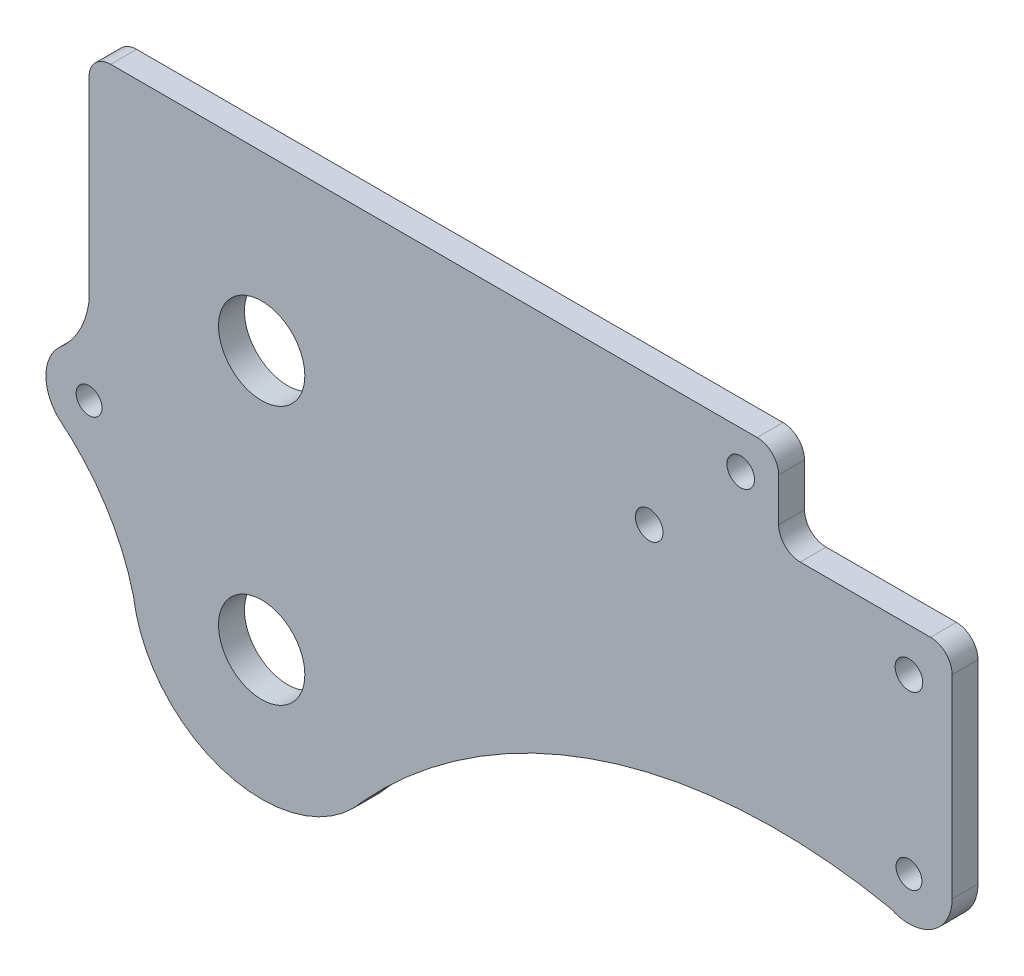
ISO-10303-21;
HEADER;
FILE_DESCRIPTION(('STEP AP214'),'2;1');
FILE_NAME('part.step','',(''),(''),'','','');
FILE_SCHEMA(('AUTOMOTIVE_DESIGN { 1 0 10303 214 1 1 1 1 }'));
ENDSEC;
DATA;
#1=APPLICATION_CONTEXT('core data for automotive mechanical design processes');
#2=APPLICATION_PROTOCOL_DEFINITION('international standard','automotive_design',2000,#1);
#3=PRODUCT_CONTEXT('',#1,'mechanical');
#4=PRODUCT('Part','Part','',(#3));
#5=PRODUCT_RELATED_PRODUCT_CATEGORY('part','',(#4));
#6=PRODUCT_DEFINITION_FORMATION('','',#4);
#7=PRODUCT_DEFINITION_CONTEXT('part definition',#1,'design');
#8=PRODUCT_DEFINITION('design','',#6,#7);
#9=PRODUCT_DEFINITION_SHAPE('','',#8);
#10=(LENGTH_UNIT() NAMED_UNIT(*) SI_UNIT(.MILLI.,.METRE.));
#11=(NAMED_UNIT(*) PLANE_ANGLE_UNIT() SI_UNIT($,.RADIAN.));
#12=(NAMED_UNIT(*) SI_UNIT($,.STERADIAN.) SOLID_ANGLE_UNIT());
#13=UNCERTAINTY_MEASURE_WITH_UNIT(LENGTH_MEASURE(1.E-05),#10,'distance_accuracy_value','');
#14=(GEOMETRIC_REPRESENTATION_CONTEXT(3) GLOBAL_UNCERTAINTY_ASSIGNED_CONTEXT((#13)) GLOBAL_UNIT_ASSIGNED_CONTEXT((#10,
#11,#12)) REPRESENTATION_CONTEXT('',''));
#15=CARTESIAN_POINT('',(0.,0.,0.));
#16=DIRECTION('',(0.,0.,1.));
#17=DIRECTION('',(1.,0.,0.));
#18=AXIS2_PLACEMENT_3D('',#15,#16,#17);
#19=CARTESIAN_POINT('',(0.,60.,3.));
#20=DIRECTION('',(0.,1.,0.));
#21=DIRECTION('',(0.,0.,1.));
#22=AXIS2_PLACEMENT_3D('',#19,#20,#21);
#23=PLANE('',#22);
#24=DIRECTION('',(1.,0.,0.));
#25=VECTOR('',#24,1.);
#26=CARTESIAN_POINT('',(0.,60.,3.));
#27=LINE('',#26,#25);
#28=CARTESIAN_POINT('',(82.3999999999994,60.,3.));
#29=VERTEX_POINT('',#28);
#30=CARTESIAN_POINT('',(97.5,60.,3.));
#31=VERTEX_POINT('',#30);
#32=EDGE_CURVE('E336',#29,#31,#27,.T.);
#33=ORIENTED_EDGE('',*,*,#32,.T.);
#34=DIRECTION('',(0.,0.,-1.));
#35=VECTOR('',#34,1.);
#36=CARTESIAN_POINT('',(97.5,60.,3.));
#37=LINE('',#36,#35);
#38=CARTESIAN_POINT('',(97.5,60.,0.));
#39=VERTEX_POINT('',#38);
#40=EDGE_CURVE('E365',#31,#39,#37,.T.);
#41=ORIENTED_EDGE('',*,*,#40,.T.);
#42=DIRECTION('',(1.,0.,0.));
#43=VECTOR('',#42,1.);
#44=CARTESIAN_POINT('',(0.,60.,0.));
#45=LINE('',#44,#43);
#46=CARTESIAN_POINT('',(82.3999999999994,60.,0.));
#47=VERTEX_POINT('',#46);
#48=EDGE_CURVE('E346',#47,#39,#45,.T.);
#49=ORIENTED_EDGE('',*,*,#48,.F.);
#50=DIRECTION('',(0.,0.,1.));
#51=VECTOR('',#50,1.);
#52=CARTESIAN_POINT('',(82.3999999999994,60.,3.));
#53=LINE('',#52,#51);
#54=EDGE_CURVE('E368',#47,#29,#53,.T.);
#55=ORIENTED_EDGE('',*,*,#54,.T.);
#56=EDGE_LOOP('',(#33,#41,#49,#55));
#57=FACE_BOUND('',#56,.T.);
#58=ADVANCED_FACE('F39',(#57),#23,.T.);
#59=CARTESIAN_POINT('',(0.,0.,3.));
#60=DIRECTION('',(0.,0.,1.));
#61=DIRECTION('',(1.,0.,0.));
#62=AXIS2_PLACEMENT_3D('',#59,#60,#61);
#63=PLANE('',#62);
#64=CARTESIAN_POINT('',(95.,55.,3.));
#65=DIRECTION('',(0.,0.,1.));
#66=DIRECTION('',(1.,0.,0.));
#67=AXIS2_PLACEMENT_3D('',#64,#65,#66);
#68=CIRCLE('',#67,1.60000000000001);
#69=CARTESIAN_POINT('',(96.6,55.,3.));
#70=VERTEX_POINT('',#69);
#71=EDGE_CURVE('E267',#70,#70,#68,.T.);
#72=ORIENTED_EDGE('',*,*,#71,.F.);
#73=EDGE_LOOP('',(#72));
#74=FACE_BOUND('',#73,.T.);
#75=CARTESIAN_POINT('',(64.8999999999994,55.,3.));
#76=DIRECTION('',(0.,0.,1.));
#77=DIRECTION('',(1.,0.,0.));
#78=AXIS2_PLACEMENT_3D('',#75,#76,#77);
#79=CIRCLE('',#78,1.60000000000001);
#80=CARTESIAN_POINT('',(66.4999999999994,55.,3.));
#81=VERTEX_POINT('',#80);
#82=EDGE_CURVE('E181',#81,#81,#79,.T.);
#83=ORIENTED_EDGE('',*,*,#82,.F.);
#84=EDGE_LOOP('',(#83));
#85=FACE_BOUND('',#84,.T.);
#86=CARTESIAN_POINT('',(20.,50.,3.));
#87=DIRECTION('',(0.,0.,1.));
#88=DIRECTION('',(1.,0.,0.));
#89=AXIS2_PLACEMENT_3D('',#86,#87,#88);
#90=CIRCLE('',#89,5.);
#91=CARTESIAN_POINT('',(25.,50.,3.));
#92=VERTEX_POINT('',#91);
#93=EDGE_CURVE('E239',#92,#92,#90,.T.);
#94=ORIENTED_EDGE('',*,*,#93,.F.);
#95=EDGE_LOOP('',(#94));
#96=FACE_BOUND('',#95,.T.);
#97=DIRECTION('',(-1.,0.,0.));
#98=VECTOR('',#97,1.);
#99=CARTESIAN_POINT('',(0.,70.,3.));
#100=LINE('',#99,#98);
#101=CARTESIAN_POINT('',(77.3999999999994,70.,3.));
#102=VERTEX_POINT('',#101);
#103=CARTESIAN_POINT('',(2.5,70.,3.));
#104=VERTEX_POINT('',#103);
#105=EDGE_CURVE('E254',#102,#104,#100,.T.);
#106=ORIENTED_EDGE('',*,*,#105,.T.);
#107=CARTESIAN_POINT('',(2.5,67.5,3.));
#108=DIRECTION('',(0.,0.,1.));
#109=DIRECTION('',(1.,0.,0.));
#110=AXIS2_PLACEMENT_3D('',#107,#108,#109);
#111=CIRCLE('',#110,2.5);
#112=CARTESIAN_POINT('',(0.,67.5,3.));
#113=VERTEX_POINT('',#112);
#114=EDGE_CURVE('E321',#104,#113,#111,.T.);
#115=ORIENTED_EDGE('',*,*,#114,.T.);
#116=DIRECTION('',(0.,-1.,0.));
#117=VECTOR('',#116,1.);
#118=CARTESIAN_POINT('',(0.,0.,3.));
#119=LINE('',#118,#117);
#120=CARTESIAN_POINT('',(0.,45.,3.));
#121=VERTEX_POINT('',#120);
#122=EDGE_CURVE('E339',#113,#121,#119,.T.);
#123=ORIENTED_EDGE('',*,*,#122,.T.);
#124=CARTESIAN_POINT('',(-9.92422965861552,46.2286845335789,3.));
#125=DIRECTION('',(0.,0.,1.));
#126=DIRECTION('',(1.,0.,0.));
#127=AXIS2_PLACEMENT_3D('',#124,#125,#126);
#128=CIRCLE('',#127,10.);
#129=CARTESIAN_POINT('',(-3.53553390593274,38.5355339059327,3.));
#130=VERTEX_POINT('',#129);
#131=EDGE_CURVE('E178',#130,#121,#128,.T.);
#132=ORIENTED_EDGE('',*,*,#131,.F.);
#133=CARTESIAN_POINT('',(0.,35.,3.));
#134=DIRECTION('',(0.,0.,1.));
#135=DIRECTION('',(1.,0.,0.));
#136=AXIS2_PLACEMENT_3D('',#133,#134,#135);
#137=CIRCLE('',#136,5.);
#138=CARTESIAN_POINT('',(-3.53553390593273,31.4644660940673,3.));
#139=VERTEX_POINT('',#138);
#140=EDGE_CURVE('E151',#130,#139,#137,.T.);
#141=ORIENTED_EDGE('',*,*,#140,.T.);
#142=CARTESIAN_POINT('',(-19.1132319588568,11.9110693719648,3.));
#143=DIRECTION('',(0.,0.,1.));
#144=DIRECTION('',(1.,0.,0.));
#145=AXIS2_PLACEMENT_3D('',#142,#143,#144);
#146=CIRCLE('',#145,25.);
#147=CARTESIAN_POINT('',(5.13393125268149,18.0000000000001,3.));
#148=VERTEX_POINT('',#147);
#149=EDGE_CURVE('E235',#139,#148,#146,.F.);
#150=ORIENTED_EDGE('',*,*,#149,.T.);
#151=CARTESIAN_POINT('',(20.,20.,3.));
#152=DIRECTION('',(0.,0.,1.));
#153=DIRECTION('',(1.,0.,0.));
#154=AXIS2_PLACEMENT_3D('',#151,#152,#153);
#155=CIRCLE('',#154,15.);
#156=CARTESIAN_POINT('',(31.7611178798317,10.6899996661276,3.));
#157=VERTEX_POINT('',#156);
#158=EDGE_CURVE('E194',#148,#157,#155,.T.);
#159=ORIENTED_EDGE('',*,*,#158,.T.);
#160=CARTESIAN_POINT('',(79.7242790227011,-33.1795247578178,3.));
#161=DIRECTION('',(0.,0.,1.));
#162=DIRECTION('',(1.,0.,0.));
#163=AXIS2_PLACEMENT_3D('',#160,#161,#162);
#164=CIRCLE('',#163,65.);
#165=CARTESIAN_POINT('',(92.8665811576552,30.4779955724117,3.));
#166=VERTEX_POINT('',#165);
#167=EDGE_CURVE('E198',#157,#166,#164,.F.);
#168=ORIENTED_EDGE('',*,*,#167,.T.);
#169=CARTESIAN_POINT('',(95.,35.,3.));
#170=DIRECTION('',(0.,0.,1.));
#171=DIRECTION('',(1.,0.,0.));
#172=AXIS2_PLACEMENT_3D('',#169,#170,#171);
#173=CIRCLE('',#172,5.00000000000001);
#174=CARTESIAN_POINT('',(100.,35.,3.));
#175=VERTEX_POINT('',#174);
#176=EDGE_CURVE('E197',#166,#175,#173,.T.);
#177=ORIENTED_EDGE('',*,*,#176,.T.);
#178=DIRECTION('',(0.,-1.,0.));
#179=VECTOR('',#178,1.);
#180=CARTESIAN_POINT('',(100.,0.,3.));
#181=LINE('',#180,#179);
#182=CARTESIAN_POINT('',(100.,57.5,3.));
#183=VERTEX_POINT('',#182);
#184=EDGE_CURVE('E325',#183,#175,#181,.T.);
#185=ORIENTED_EDGE('',*,*,#184,.F.);
#186=CARTESIAN_POINT('',(97.5,57.5,3.));
#187=DIRECTION('',(0.,0.,1.));
#188=DIRECTION('',(1.,0.,0.));
#189=AXIS2_PLACEMENT_3D('',#186,#187,#188);
#190=CIRCLE('',#189,2.5);
#191=EDGE_CURVE('E324',#183,#31,#190,.T.);
#192=ORIENTED_EDGE('',*,*,#191,.T.);
#193=ORIENTED_EDGE('',*,*,#32,.F.);
#194=CARTESIAN_POINT('',(82.3999999999994,62.5,3.));
#195=DIRECTION('',(0.,0.,1.));
#196=DIRECTION('',(1.,0.,0.));
#197=AXIS2_PLACEMENT_3D('',#194,#195,#196);
#198=CIRCLE('',#197,2.5);
#199=CARTESIAN_POINT('',(79.8999999999994,62.5,3.));
#200=VERTEX_POINT('',#199);
#201=EDGE_CURVE('E47',#29,#200,#198,.F.);
#202=ORIENTED_EDGE('',*,*,#201,.T.);
#203=DIRECTION('',(0.,1.,0.));
#204=VECTOR('',#203,1.);
#205=CARTESIAN_POINT('',(79.8999999999994,60.,3.));
#206=LINE('',#205,#204);
#207=CARTESIAN_POINT('',(79.8999999999994,67.5,3.));
#208=VERTEX_POINT('',#207);
#209=EDGE_CURVE('E260',#200,#208,#206,.T.);
#210=ORIENTED_EDGE('',*,*,#209,.T.);
#211=CARTESIAN_POINT('',(77.3999999999994,67.5,3.));
#212=DIRECTION('',(0.,0.,1.));
#213=DIRECTION('',(1.,0.,0.));
#214=AXIS2_PLACEMENT_3D('',#211,#212,#213);
#215=CIRCLE('',#214,2.5);
#216=EDGE_CURVE('E322',#208,#102,#215,.T.);
#217=ORIENTED_EDGE('',*,*,#216,.T.);
#218=EDGE_LOOP('',(#106,#115,#123,#132,#141,#150,#159,#168,#177,#185,#192,#193,#202,#210,#217));
#219=FACE_BOUND('',#218,.T.);
#220=CARTESIAN_POINT('',(95.,35.,3.));
#221=DIRECTION('',(0.,0.,1.));
#222=DIRECTION('',(1.,0.,0.));
#223=AXIS2_PLACEMENT_3D('',#220,#221,#222);
#224=CIRCLE('',#223,1.5);
#225=CARTESIAN_POINT('',(96.5,35.,3.));
#226=VERTEX_POINT('',#225);
#227=EDGE_CURVE('E207',#226,#226,#224,.T.);
#228=ORIENTED_EDGE('',*,*,#227,.F.);
#229=EDGE_LOOP('',(#228));
#230=FACE_BOUND('',#229,.T.);
#231=CARTESIAN_POINT('',(20.,20.,3.));
#232=DIRECTION('',(0.,0.,1.));
#233=DIRECTION('',(1.,0.,0.));
#234=AXIS2_PLACEMENT_3D('',#231,#232,#233);
#235=CIRCLE('',#234,5.);
#236=CARTESIAN_POINT('',(25.,20.,3.));
#237=VERTEX_POINT('',#236);
#238=EDGE_CURVE('E223',#237,#237,#235,.T.);
#239=ORIENTED_EDGE('',*,*,#238,.F.);
#240=EDGE_LOOP('',(#239));
#241=FACE_BOUND('',#240,.T.);
#242=CARTESIAN_POINT('',(0.,35.,3.));
#243=DIRECTION('',(0.,0.,1.));
#244=DIRECTION('',(1.,0.,0.));
#245=AXIS2_PLACEMENT_3D('',#242,#243,#244);
#246=CIRCLE('',#245,1.5);
#247=CARTESIAN_POINT('',(1.50000000000001,35.,3.));
#248=VERTEX_POINT('',#247);
#249=EDGE_CURVE('E165',#248,#248,#246,.T.);
#250=ORIENTED_EDGE('',*,*,#249,.F.);
#251=EDGE_LOOP('',(#250));
#252=FACE_BOUND('',#251,.T.);
#253=CARTESIAN_POINT('',(75.5066017177976,65.6066017177982,3.));
#254=DIRECTION('',(0.,0.,1.));
#255=DIRECTION('',(1.,0.,0.));
#256=AXIS2_PLACEMENT_3D('',#253,#254,#255);
#257=CIRCLE('',#256,1.60000000000001);
#258=CARTESIAN_POINT('',(77.1066017177976,65.6066017177982,3.));
#259=VERTEX_POINT('',#258);
#260=EDGE_CURVE('E298',#259,#259,#257,.T.);
#261=ORIENTED_EDGE('',*,*,#260,.F.);
#262=EDGE_LOOP('',(#261));
#263=FACE_BOUND('',#262,.T.);
#264=ADVANCED_FACE('F280',(#74,#85,#96,#219,#230,#241,#252,#263),#63,.T.);
#265=CARTESIAN_POINT('',(0.,0.,0.));
#266=DIRECTION('',(0.,0.,1.));
#267=DIRECTION('',(1.,0.,0.));
#268=AXIS2_PLACEMENT_3D('',#265,#266,#267);
#269=PLANE('',#268);
#270=CARTESIAN_POINT('',(95.,55.,0.));
#271=DIRECTION('',(0.,0.,1.));
#272=DIRECTION('',(1.,0.,0.));
#273=AXIS2_PLACEMENT_3D('',#270,#271,#272);
#274=CIRCLE('',#273,1.60000000000001);
#275=CARTESIAN_POINT('',(96.6,55.,0.));
#276=VERTEX_POINT('',#275);
#277=EDGE_CURVE('E263',#276,#276,#274,.T.);
#278=ORIENTED_EDGE('',*,*,#277,.T.);
#279=EDGE_LOOP('',(#278));
#280=FACE_BOUND('',#279,.T.);
#281=CARTESIAN_POINT('',(64.8999999999994,55.,0.));
#282=DIRECTION('',(0.,0.,1.));
#283=DIRECTION('',(1.,0.,0.));
#284=AXIS2_PLACEMENT_3D('',#281,#282,#283);
#285=CIRCLE('',#284,1.60000000000001);
#286=CARTESIAN_POINT('',(66.4999999999994,55.,0.));
#287=VERTEX_POINT('',#286);
#288=EDGE_CURVE('E266',#287,#287,#285,.T.);
#289=ORIENTED_EDGE('',*,*,#288,.T.);
#290=EDGE_LOOP('',(#289));
#291=FACE_BOUND('',#290,.T.);
#292=CARTESIAN_POINT('',(20.,50.,0.));
#293=DIRECTION('',(0.,0.,1.));
#294=DIRECTION('',(1.,0.,0.));
#295=AXIS2_PLACEMENT_3D('',#292,#293,#294);
#296=CIRCLE('',#295,5.);
#297=CARTESIAN_POINT('',(25.,50.,0.));
#298=VERTEX_POINT('',#297);
#299=EDGE_CURVE('E241',#298,#298,#296,.T.);
#300=ORIENTED_EDGE('',*,*,#299,.T.);
#301=EDGE_LOOP('',(#300));
#302=FACE_BOUND('',#301,.T.);
#303=DIRECTION('',(0.,-1.,0.));
#304=VECTOR('',#303,1.);
#305=CARTESIAN_POINT('',(0.,0.,0.));
#306=LINE('',#305,#304);
#307=CARTESIAN_POINT('',(0.,67.5,0.));
#308=VERTEX_POINT('',#307);
#309=CARTESIAN_POINT('',(0.,45.,0.));
#310=VERTEX_POINT('',#309);
#311=EDGE_CURVE('E345',#308,#310,#306,.T.);
#312=ORIENTED_EDGE('',*,*,#311,.F.);
#313=CARTESIAN_POINT('',(2.5,67.5,0.));
#314=DIRECTION('',(0.,0.,1.));
#315=DIRECTION('',(1.,0.,0.));
#316=AXIS2_PLACEMENT_3D('',#313,#314,#315);
#317=CIRCLE('',#316,2.5);
#318=CARTESIAN_POINT('',(2.5,70.,0.));
#319=VERTEX_POINT('',#318);
#320=EDGE_CURVE('E320',#308,#319,#317,.F.);
#321=ORIENTED_EDGE('',*,*,#320,.T.);
#322=DIRECTION('',(-1.,0.,0.));
#323=VECTOR('',#322,1.);
#324=CARTESIAN_POINT('',(0.,70.,0.));
#325=LINE('',#324,#323);
#326=CARTESIAN_POINT('',(77.3999999999994,70.,0.));
#327=VERTEX_POINT('',#326);
#328=EDGE_CURVE('E271',#327,#319,#325,.T.);
#329=ORIENTED_EDGE('',*,*,#328,.F.);
#330=CARTESIAN_POINT('',(77.3999999999994,67.5,0.));
#331=DIRECTION('',(0.,0.,1.));
#332=DIRECTION('',(1.,0.,0.));
#333=AXIS2_PLACEMENT_3D('',#330,#331,#332);
#334=CIRCLE('',#333,2.5);
#335=CARTESIAN_POINT('',(79.8999999999994,67.5,0.));
#336=VERTEX_POINT('',#335);
#337=EDGE_CURVE('E418',#327,#336,#334,.F.);
#338=ORIENTED_EDGE('',*,*,#337,.T.);
#339=DIRECTION('',(0.,1.,0.));
#340=VECTOR('',#339,1.);
#341=CARTESIAN_POINT('',(79.8999999999994,60.,0.));
#342=LINE('',#341,#340);
#343=CARTESIAN_POINT('',(79.8999999999994,62.5,0.));
#344=VERTEX_POINT('',#343);
#345=EDGE_CURVE('E259',#344,#336,#342,.T.);
#346=ORIENTED_EDGE('',*,*,#345,.F.);
#347=CARTESIAN_POINT('',(82.3999999999994,62.5,0.));
#348=DIRECTION('',(0.,0.,1.));
#349=DIRECTION('',(1.,0.,0.));
#350=AXIS2_PLACEMENT_3D('',#347,#348,#349);
#351=CIRCLE('',#350,2.5);
#352=EDGE_CURVE('E12',#344,#47,#351,.T.);
#353=ORIENTED_EDGE('',*,*,#352,.T.);
#354=ORIENTED_EDGE('',*,*,#48,.T.);
#355=CARTESIAN_POINT('',(97.5,57.5,0.));
#356=DIRECTION('',(0.,0.,1.));
#357=DIRECTION('',(1.,0.,0.));
#358=AXIS2_PLACEMENT_3D('',#355,#356,#357);
#359=CIRCLE('',#358,2.5);
#360=CARTESIAN_POINT('',(100.,57.5,0.));
#361=VERTEX_POINT('',#360);
#362=EDGE_CURVE('E54',#39,#361,#359,.F.);
#363=ORIENTED_EDGE('',*,*,#362,.T.);
#364=DIRECTION('',(0.,-1.,0.));
#365=VECTOR('',#364,1.);
#366=CARTESIAN_POINT('',(100.,0.,0.));
#367=LINE('',#366,#365);
#368=CARTESIAN_POINT('',(100.,35.,0.));
#369=VERTEX_POINT('',#368);
#370=EDGE_CURVE('E348',#361,#369,#367,.T.);
#371=ORIENTED_EDGE('',*,*,#370,.T.);
#372=CARTESIAN_POINT('',(95.,35.,0.));
#373=DIRECTION('',(0.,0.,1.));
#374=DIRECTION('',(1.,0.,0.));
#375=AXIS2_PLACEMENT_3D('',#372,#373,#374);
#376=CIRCLE('',#375,5.00000000000001);
#377=CARTESIAN_POINT('',(92.8665811576552,30.4779955724117,0.));
#378=VERTEX_POINT('',#377);
#379=EDGE_CURVE('E215',#378,#369,#376,.T.);
#380=ORIENTED_EDGE('',*,*,#379,.F.);
#381=CARTESIAN_POINT('',(79.7242790227011,-33.1795247578178,0.));
#382=DIRECTION('',(0.,0.,1.));
#383=DIRECTION('',(1.,0.,0.));
#384=AXIS2_PLACEMENT_3D('',#381,#382,#383);
#385=CIRCLE('',#384,65.);
#386=CARTESIAN_POINT('',(31.7611178798317,10.6899996661276,0.));
#387=VERTEX_POINT('',#386);
#388=EDGE_CURVE('E203',#387,#378,#385,.F.);
#389=ORIENTED_EDGE('',*,*,#388,.F.);
#390=CARTESIAN_POINT('',(20.,20.,0.));
#391=DIRECTION('',(0.,0.,1.));
#392=DIRECTION('',(1.,0.,0.));
#393=AXIS2_PLACEMENT_3D('',#390,#391,#392);
#394=CIRCLE('',#393,15.);
#395=CARTESIAN_POINT('',(5.1339312526815,18.,0.));
#396=VERTEX_POINT('',#395);
#397=EDGE_CURVE('E357',#396,#387,#394,.T.);
#398=ORIENTED_EDGE('',*,*,#397,.F.);
#399=CARTESIAN_POINT('',(-19.1132319588568,11.9110693719648,0.));
#400=DIRECTION('',(0.,0.,1.));
#401=DIRECTION('',(1.,0.,0.));
#402=AXIS2_PLACEMENT_3D('',#399,#400,#401);
#403=CIRCLE('',#402,25.);
#404=CARTESIAN_POINT('',(-3.53553390593273,31.4644660940673,0.));
#405=VERTEX_POINT('',#404);
#406=EDGE_CURVE('E171',#405,#396,#403,.F.);
#407=ORIENTED_EDGE('',*,*,#406,.F.);
#408=CARTESIAN_POINT('',(0.,35.,0.));
#409=DIRECTION('',(0.,0.,1.));
#410=DIRECTION('',(1.,0.,0.));
#411=AXIS2_PLACEMENT_3D('',#408,#409,#410);
#412=CIRCLE('',#411,5.);
#413=CARTESIAN_POINT('',(-3.53553390593274,38.5355339059327,0.));
#414=VERTEX_POINT('',#413);
#415=EDGE_CURVE('E149',#414,#405,#412,.T.);
#416=ORIENTED_EDGE('',*,*,#415,.F.);
#417=CARTESIAN_POINT('',(-9.92422965861552,46.2286845335789,0.));
#418=DIRECTION('',(0.,0.,1.));
#419=DIRECTION('',(1.,0.,0.));
#420=AXIS2_PLACEMENT_3D('',#417,#418,#419);
#421=CIRCLE('',#420,10.);
#422=EDGE_CURVE('E160',#414,#310,#421,.T.);
#423=ORIENTED_EDGE('',*,*,#422,.T.);
#424=EDGE_LOOP('',(#312,#321,#329,#338,#346,#353,#354,#363,#371,#380,#389,#398,#407,#416,#423));
#425=FACE_BOUND('',#424,.T.);
#426=CARTESIAN_POINT('',(20.,20.,0.));
#427=DIRECTION('',(0.,0.,1.));
#428=DIRECTION('',(1.,0.,0.));
#429=AXIS2_PLACEMENT_3D('',#426,#427,#428);
#430=CIRCLE('',#429,5.);
#431=CARTESIAN_POINT('',(25.,20.,0.));
#432=VERTEX_POINT('',#431);
#433=EDGE_CURVE('E219',#432,#432,#430,.T.);
#434=ORIENTED_EDGE('',*,*,#433,.T.);
#435=EDGE_LOOP('',(#434));
#436=FACE_BOUND('',#435,.T.);
#437=CARTESIAN_POINT('',(95.,35.,0.));
#438=DIRECTION('',(0.,0.,1.));
#439=DIRECTION('',(1.,0.,0.));
#440=AXIS2_PLACEMENT_3D('',#437,#438,#439);
#441=CIRCLE('',#440,1.5);
#442=CARTESIAN_POINT('',(96.5,35.,0.));
#443=VERTEX_POINT('',#442);
#444=EDGE_CURVE('E216',#443,#443,#441,.T.);
#445=ORIENTED_EDGE('',*,*,#444,.T.);
#446=EDGE_LOOP('',(#445));
#447=FACE_BOUND('',#446,.T.);
#448=CARTESIAN_POINT('',(0.,35.,0.));
#449=DIRECTION('',(0.,0.,1.));
#450=DIRECTION('',(1.,0.,0.));
#451=AXIS2_PLACEMENT_3D('',#448,#449,#450);
#452=CIRCLE('',#451,1.5);
#453=CARTESIAN_POINT('',(1.50000000000001,35.,0.));
#454=VERTEX_POINT('',#453);
#455=EDGE_CURVE('E156',#454,#454,#452,.T.);
#456=ORIENTED_EDGE('',*,*,#455,.T.);
#457=EDGE_LOOP('',(#456));
#458=FACE_BOUND('',#457,.T.);
#459=CARTESIAN_POINT('',(75.5066017177976,65.6066017177982,0.));
#460=DIRECTION('',(0.,0.,1.));
#461=DIRECTION('',(1.,0.,0.));
#462=AXIS2_PLACEMENT_3D('',#459,#460,#461);
#463=CIRCLE('',#462,1.60000000000001);
#464=CARTESIAN_POINT('',(77.1066017177976,65.6066017177982,0.));
#465=VERTEX_POINT('',#464);
#466=EDGE_CURVE('E300',#465,#465,#463,.T.);
#467=ORIENTED_EDGE('',*,*,#466,.T.);
#468=EDGE_LOOP('',(#467));
#469=FACE_BOUND('',#468,.T.);
#470=ADVANCED_FACE('F168',(#280,#291,#302,#425,#436,#447,#458,#469),#269,.F.);
#471=CARTESIAN_POINT('',(0.,0.,3.));
#472=DIRECTION('',(1.,0.,0.));
#473=DIRECTION('',(0.,1.,0.));
#474=AXIS2_PLACEMENT_3D('',#471,#472,#473);
#475=PLANE('',#474);
#476=ORIENTED_EDGE('',*,*,#122,.F.);
#477=DIRECTION('',(0.,0.,1.));
#478=VECTOR('',#477,1.);
#479=CARTESIAN_POINT('',(0.,67.5,0.));
#480=LINE('',#479,#478);
#481=EDGE_CURVE('E419',#113,#308,#480,.F.);
#482=ORIENTED_EDGE('',*,*,#481,.T.);
#483=ORIENTED_EDGE('',*,*,#311,.T.);
#484=DIRECTION('',(0.,0.,1.));
#485=VECTOR('',#484,1.);
#486=CARTESIAN_POINT('',(0.,45.,0.));
#487=LINE('',#486,#485);
#488=EDGE_CURVE('E163',#310,#121,#487,.T.);
#489=ORIENTED_EDGE('',*,*,#488,.T.);
#490=EDGE_LOOP('',(#476,#482,#483,#489));
#491=FACE_BOUND('',#490,.T.);
#492=ADVANCED_FACE('F399',(#491),#475,.F.);
#493=CARTESIAN_POINT('',(100.,0.,3.));
#494=DIRECTION('',(1.,0.,0.));
#495=DIRECTION('',(0.,0.,-1.));
#496=AXIS2_PLACEMENT_3D('',#493,#494,#495);
#497=PLANE('',#496);
#498=ORIENTED_EDGE('',*,*,#370,.F.);
#499=DIRECTION('',(0.,0.,-1.));
#500=VECTOR('',#499,1.);
#501=CARTESIAN_POINT('',(100.,57.5,3.));
#502=LINE('',#501,#500);
#503=EDGE_CURVE('E360',#361,#183,#502,.F.);
#504=ORIENTED_EDGE('',*,*,#503,.T.);
#505=ORIENTED_EDGE('',*,*,#184,.T.);
#506=DIRECTION('',(0.,0.,1.));
#507=VECTOR('',#506,1.);
#508=CARTESIAN_POINT('',(100.,35.,0.));
#509=LINE('',#508,#507);
#510=EDGE_CURVE('E208',#369,#175,#509,.T.);
#511=ORIENTED_EDGE('',*,*,#510,.F.);
#512=EDGE_LOOP('',(#498,#504,#505,#511));
#513=FACE_BOUND('',#512,.T.);
#514=ADVANCED_FACE('F358',(#513),#497,.T.);
#515=CARTESIAN_POINT('',(20.,20.,3.));
#516=DIRECTION('',(0.,0.,-1.));
#517=DIRECTION('',(-1.,0.,0.));
#518=AXIS2_PLACEMENT_3D('',#515,#516,#517);
#519=CYLINDRICAL_SURFACE('',#518,5.);
#520=ORIENTED_EDGE('',*,*,#238,.T.);
#521=EDGE_LOOP('',(#520));
#522=FACE_BOUND('',#521,.T.);
#523=ORIENTED_EDGE('',*,*,#433,.F.);
#524=EDGE_LOOP('',(#523));
#525=FACE_BOUND('',#524,.T.);
#526=ADVANCED_FACE('F398',(#522,#525),#519,.F.);
#527=CARTESIAN_POINT('',(95.,35.,0.));
#528=DIRECTION('',(0.,0.,1.));
#529=DIRECTION('',(1.,0.,0.));
#530=AXIS2_PLACEMENT_3D('',#527,#528,#529);
#531=CYLINDRICAL_SURFACE('',#530,1.5);
#532=ORIENTED_EDGE('',*,*,#444,.F.);
#533=EDGE_LOOP('',(#532));
#534=FACE_BOUND('',#533,.T.);
#535=ORIENTED_EDGE('',*,*,#227,.T.);
#536=EDGE_LOOP('',(#535));
#537=FACE_BOUND('',#536,.T.);
#538=ADVANCED_FACE('F405',(#534,#537),#531,.F.);
#539=CARTESIAN_POINT('',(79.7242790227011,-33.1795247578178,0.));
#540=DIRECTION('',(0.,0.,1.));
#541=DIRECTION('',(1.,0.,0.));
#542=AXIS2_PLACEMENT_3D('',#539,#540,#541);
#543=CYLINDRICAL_SURFACE('',#542,65.);
#544=ORIENTED_EDGE('',*,*,#167,.F.);
#545=DIRECTION('',(0.,0.,1.));
#546=VECTOR('',#545,1.);
#547=CARTESIAN_POINT('',(31.7611178798317,10.6899996661276,0.));
#548=LINE('',#547,#546);
#549=EDGE_CURVE('E212',#387,#157,#548,.T.);
#550=ORIENTED_EDGE('',*,*,#549,.F.);
#551=ORIENTED_EDGE('',*,*,#388,.T.);
#552=DIRECTION('',(0.,0.,1.));
#553=VECTOR('',#552,1.);
#554=CARTESIAN_POINT('',(92.8665811576552,30.4779955724117,0.));
#555=LINE('',#554,#553);
#556=EDGE_CURVE('E204',#378,#166,#555,.T.);
#557=ORIENTED_EDGE('',*,*,#556,.T.);
#558=EDGE_LOOP('',(#544,#550,#551,#557));
#559=FACE_BOUND('',#558,.T.);
#560=ADVANCED_FACE('F433',(#559),#543,.F.);
#561=CARTESIAN_POINT('',(95.,35.,0.));
#562=DIRECTION('',(0.,0.,1.));
#563=DIRECTION('',(1.,0.,0.));
#564=AXIS2_PLACEMENT_3D('',#561,#562,#563);
#565=CYLINDRICAL_SURFACE('',#564,5.00000000000001);
#566=ORIENTED_EDGE('',*,*,#176,.F.);
#567=ORIENTED_EDGE('',*,*,#556,.F.);
#568=ORIENTED_EDGE('',*,*,#379,.T.);
#569=ORIENTED_EDGE('',*,*,#510,.T.);
#570=EDGE_LOOP('',(#566,#567,#568,#569));
#571=FACE_BOUND('',#570,.T.);
#572=ADVANCED_FACE('F356',(#571),#565,.T.);
#573=CARTESIAN_POINT('',(20.,20.,0.));
#574=DIRECTION('',(0.,0.,1.));
#575=DIRECTION('',(1.,0.,0.));
#576=AXIS2_PLACEMENT_3D('',#573,#574,#575);
#577=CYLINDRICAL_SURFACE('',#576,15.);
#578=DIRECTION('',(0.,0.,1.));
#579=VECTOR('',#578,1.);
#580=CARTESIAN_POINT('',(5.1339312526815,18.,0.));
#581=LINE('',#580,#579);
#582=EDGE_CURVE('E236',#396,#148,#581,.T.);
#583=ORIENTED_EDGE('',*,*,#582,.F.);
#584=ORIENTED_EDGE('',*,*,#397,.T.);
#585=ORIENTED_EDGE('',*,*,#549,.T.);
#586=ORIENTED_EDGE('',*,*,#158,.F.);
#587=EDGE_LOOP('',(#583,#584,#585,#586));
#588=FACE_BOUND('',#587,.T.);
#589=ADVANCED_FACE('F429',(#588),#577,.T.);
#590=CARTESIAN_POINT('',(20.,50.,0.));
#591=DIRECTION('',(0.,0.,1.));
#592=DIRECTION('',(1.,0.,0.));
#593=AXIS2_PLACEMENT_3D('',#590,#591,#592);
#594=CYLINDRICAL_SURFACE('',#593,5.);
#595=ORIENTED_EDGE('',*,*,#299,.F.);
#596=EDGE_LOOP('',(#595));
#597=FACE_BOUND('',#596,.T.);
#598=ORIENTED_EDGE('',*,*,#93,.T.);
#599=EDGE_LOOP('',(#598));
#600=FACE_BOUND('',#599,.T.);
#601=ADVANCED_FACE('F445',(#597,#600),#594,.F.);
#602=CARTESIAN_POINT('',(-9.92422965861552,46.2286845335789,0.));
#603=DIRECTION('',(0.,0.,1.));
#604=DIRECTION('',(1.,0.,0.));
#605=AXIS2_PLACEMENT_3D('',#602,#603,#604);
#606=CYLINDRICAL_SURFACE('',#605,10.);
#607=ORIENTED_EDGE('',*,*,#131,.T.);
#608=ORIENTED_EDGE('',*,*,#488,.F.);
#609=ORIENTED_EDGE('',*,*,#422,.F.);
#610=DIRECTION('',(0.,0.,1.));
#611=VECTOR('',#610,1.);
#612=CARTESIAN_POINT('',(-3.53553390593274,38.5355339059327,0.));
#613=LINE('',#612,#611);
#614=EDGE_CURVE('E145',#414,#130,#613,.T.);
#615=ORIENTED_EDGE('',*,*,#614,.T.);
#616=EDGE_LOOP('',(#607,#608,#609,#615));
#617=FACE_BOUND('',#616,.T.);
#618=ADVANCED_FACE('F161',(#617),#606,.F.);
#619=CARTESIAN_POINT('',(-19.1132319588568,11.9110693719648,0.));
#620=DIRECTION('',(0.,0.,1.));
#621=DIRECTION('',(1.,0.,0.));
#622=AXIS2_PLACEMENT_3D('',#619,#620,#621);
#623=CYLINDRICAL_SURFACE('',#622,25.);
#624=ORIENTED_EDGE('',*,*,#149,.F.);
#625=DIRECTION('',(0.,0.,1.));
#626=VECTOR('',#625,1.);
#627=CARTESIAN_POINT('',(-3.53553390593273,31.4644660940673,0.));
#628=LINE('',#627,#626);
#629=EDGE_CURVE('E155',#405,#139,#628,.T.);
#630=ORIENTED_EDGE('',*,*,#629,.F.);
#631=ORIENTED_EDGE('',*,*,#406,.T.);
#632=ORIENTED_EDGE('',*,*,#582,.T.);
#633=EDGE_LOOP('',(#624,#630,#631,#632));
#634=FACE_BOUND('',#633,.T.);
#635=ADVANCED_FACE('F427',(#634),#623,.F.);
#636=CARTESIAN_POINT('',(0.,35.,0.));
#637=DIRECTION('',(0.,0.,1.));
#638=DIRECTION('',(1.,0.,0.));
#639=AXIS2_PLACEMENT_3D('',#636,#637,#638);
#640=CYLINDRICAL_SURFACE('',#639,5.);
#641=ORIENTED_EDGE('',*,*,#140,.F.);
#642=ORIENTED_EDGE('',*,*,#614,.F.);
#643=ORIENTED_EDGE('',*,*,#415,.T.);
#644=ORIENTED_EDGE('',*,*,#629,.T.);
#645=EDGE_LOOP('',(#641,#642,#643,#644));
#646=FACE_BOUND('',#645,.T.);
#647=ADVANCED_FACE('F147',(#646),#640,.T.);
#648=CARTESIAN_POINT('',(0.,35.,0.));
#649=DIRECTION('',(0.,0.,1.));
#650=DIRECTION('',(1.,0.,0.));
#651=AXIS2_PLACEMENT_3D('',#648,#649,#650);
#652=CYLINDRICAL_SURFACE('',#651,1.5);
#653=ORIENTED_EDGE('',*,*,#455,.F.);
#654=EDGE_LOOP('',(#653));
#655=FACE_BOUND('',#654,.T.);
#656=ORIENTED_EDGE('',*,*,#249,.T.);
#657=EDGE_LOOP('',(#656));
#658=FACE_BOUND('',#657,.T.);
#659=ADVANCED_FACE('F454',(#655,#658),#652,.F.);
#660=CARTESIAN_POINT('',(64.8999999999994,55.,0.));
#661=DIRECTION('',(0.,0.,1.));
#662=DIRECTION('',(1.,0.,0.));
#663=AXIS2_PLACEMENT_3D('',#660,#661,#662);
#664=CYLINDRICAL_SURFACE('',#663,1.60000000000001);
#665=ORIENTED_EDGE('',*,*,#82,.T.);
#666=EDGE_LOOP('',(#665));
#667=FACE_BOUND('',#666,.T.);
#668=ORIENTED_EDGE('',*,*,#288,.F.);
#669=EDGE_LOOP('',(#668));
#670=FACE_BOUND('',#669,.T.);
#671=ADVANCED_FACE('F277',(#667,#670),#664,.F.);
#672=CARTESIAN_POINT('',(95.,55.,0.));
#673=DIRECTION('',(0.,0.,1.));
#674=DIRECTION('',(1.,0.,0.));
#675=AXIS2_PLACEMENT_3D('',#672,#673,#674);
#676=CYLINDRICAL_SURFACE('',#675,1.60000000000001);
#677=ORIENTED_EDGE('',*,*,#277,.F.);
#678=EDGE_LOOP('',(#677));
#679=FACE_BOUND('',#678,.T.);
#680=ORIENTED_EDGE('',*,*,#71,.T.);
#681=EDGE_LOOP('',(#680));
#682=FACE_BOUND('',#681,.T.);
#683=ADVANCED_FACE('F462',(#679,#682),#676,.F.);
#684=CARTESIAN_POINT('',(0.,70.,0.));
#685=DIRECTION('',(0.,1.,0.));
#686=DIRECTION('',(-1.,0.,0.));
#687=AXIS2_PLACEMENT_3D('',#684,#685,#686);
#688=PLANE('',#687);
#689=ORIENTED_EDGE('',*,*,#328,.T.);
#690=DIRECTION('',(0.,0.,1.));
#691=VECTOR('',#690,1.);
#692=CARTESIAN_POINT('',(2.5,70.,3.));
#693=LINE('',#692,#691);
#694=EDGE_CURVE('E312',#319,#104,#693,.T.);
#695=ORIENTED_EDGE('',*,*,#694,.T.);
#696=ORIENTED_EDGE('',*,*,#105,.F.);
#697=DIRECTION('',(0.,0.,1.));
#698=VECTOR('',#697,1.);
#699=CARTESIAN_POINT('',(77.3999999999994,70.,0.));
#700=LINE('',#699,#698);
#701=EDGE_CURVE('E314',#102,#327,#700,.F.);
#702=ORIENTED_EDGE('',*,*,#701,.T.);
#703=EDGE_LOOP('',(#689,#695,#696,#702));
#704=FACE_BOUND('',#703,.T.);
#705=ADVANCED_FACE('F311',(#704),#688,.T.);
#706=CARTESIAN_POINT('',(79.8999999999994,60.,0.));
#707=DIRECTION('',(1.,0.,0.));
#708=DIRECTION('',(0.,0.,-1.));
#709=AXIS2_PLACEMENT_3D('',#706,#707,#708);
#710=PLANE('',#709);
#711=ORIENTED_EDGE('',*,*,#209,.F.);
#712=DIRECTION('',(0.,0.,1.));
#713=VECTOR('',#712,1.);
#714=CARTESIAN_POINT('',(79.8999999999994,62.5,0.));
#715=LINE('',#714,#713);
#716=EDGE_CURVE('E378',#200,#344,#715,.F.);
#717=ORIENTED_EDGE('',*,*,#716,.T.);
#718=ORIENTED_EDGE('',*,*,#345,.T.);
#719=DIRECTION('',(0.,0.,1.));
#720=VECTOR('',#719,1.);
#721=CARTESIAN_POINT('',(79.8999999999994,67.5,0.));
#722=LINE('',#721,#720);
#723=EDGE_CURVE('E370',#336,#208,#722,.T.);
#724=ORIENTED_EDGE('',*,*,#723,.T.);
#725=EDGE_LOOP('',(#711,#717,#718,#724));
#726=FACE_BOUND('',#725,.T.);
#727=ADVANCED_FACE('F385',(#726),#710,.T.);
#728=CARTESIAN_POINT('',(75.5066017177976,65.6066017177982,0.));
#729=DIRECTION('',(0.,0.,1.));
#730=DIRECTION('',(1.,0.,0.));
#731=AXIS2_PLACEMENT_3D('',#728,#729,#730);
#732=CYLINDRICAL_SURFACE('',#731,1.60000000000001);
#733=ORIENTED_EDGE('',*,*,#466,.F.);
#734=EDGE_LOOP('',(#733));
#735=FACE_BOUND('',#734,.T.);
#736=ORIENTED_EDGE('',*,*,#260,.T.);
#737=EDGE_LOOP('',(#736));
#738=FACE_BOUND('',#737,.T.);
#739=ADVANCED_FACE('F409',(#735,#738),#732,.F.);
#740=CARTESIAN_POINT('',(2.5,67.5,0.));
#741=DIRECTION('',(0.,0.,-1.));
#742=DIRECTION('',(-1.,0.,0.));
#743=AXIS2_PLACEMENT_3D('',#740,#741,#742);
#744=CYLINDRICAL_SURFACE('',#743,2.5);
#745=ORIENTED_EDGE('',*,*,#320,.F.);
#746=ORIENTED_EDGE('',*,*,#481,.F.);
#747=ORIENTED_EDGE('',*,*,#114,.F.);
#748=ORIENTED_EDGE('',*,*,#694,.F.);
#749=EDGE_LOOP('',(#745,#746,#747,#748));
#750=FACE_BOUND('',#749,.T.);
#751=ADVANCED_FACE('F318',(#750),#744,.T.);
#752=CARTESIAN_POINT('',(97.5,57.5,3.));
#753=DIRECTION('',(0.,0.,-1.));
#754=DIRECTION('',(-1.,0.,0.));
#755=AXIS2_PLACEMENT_3D('',#752,#753,#754);
#756=CYLINDRICAL_SURFACE('',#755,2.5);
#757=ORIENTED_EDGE('',*,*,#191,.F.);
#758=ORIENTED_EDGE('',*,*,#503,.F.);
#759=ORIENTED_EDGE('',*,*,#362,.F.);
#760=ORIENTED_EDGE('',*,*,#40,.F.);
#761=EDGE_LOOP('',(#757,#758,#759,#760));
#762=FACE_BOUND('',#761,.T.);
#763=ADVANCED_FACE('F364',(#762),#756,.T.);
#764=CARTESIAN_POINT('',(82.3999999999994,62.5,3.));
#765=DIRECTION('',(0.,0.,-1.));
#766=DIRECTION('',(-1.,0.,0.));
#767=AXIS2_PLACEMENT_3D('',#764,#765,#766);
#768=CYLINDRICAL_SURFACE('',#767,2.5);
#769=ORIENTED_EDGE('',*,*,#352,.F.);
#770=ORIENTED_EDGE('',*,*,#716,.F.);
#771=ORIENTED_EDGE('',*,*,#201,.F.);
#772=ORIENTED_EDGE('',*,*,#54,.F.);
#773=EDGE_LOOP('',(#769,#770,#771,#772));
#774=FACE_BOUND('',#773,.T.);
#775=ADVANCED_FACE('F389',(#774),#768,.F.);
#776=CARTESIAN_POINT('',(77.3999999999994,67.5,0.));
#777=DIRECTION('',(0.,0.,1.));
#778=DIRECTION('',(1.,0.,0.));
#779=AXIS2_PLACEMENT_3D('',#776,#777,#778);
#780=CYLINDRICAL_SURFACE('',#779,2.5);
#781=ORIENTED_EDGE('',*,*,#337,.F.);
#782=ORIENTED_EDGE('',*,*,#701,.F.);
#783=ORIENTED_EDGE('',*,*,#216,.F.);
#784=ORIENTED_EDGE('',*,*,#723,.F.);
#785=EDGE_LOOP('',(#781,#782,#783,#784));
#786=FACE_BOUND('',#785,.T.);
#787=ADVANCED_FACE('F41',(#786),#780,.T.);
#788=CLOSED_SHELL('',(#58,#264,#470,#492,#514,#526,#538,#560,#572,#589,#601,#618,#635,#647,#659,
#671,#683,#705,#727,#739,#751,#763,#775,#787));
#789=MANIFOLD_SOLID_BREP('B2',#788);
#790=ADVANCED_BREP_SHAPE_REPRESENTATION('',(#18,#789),#14);
#791=SHAPE_DEFINITION_REPRESENTATION(#9,#790);
ENDSEC;
END-ISO-10303-21;
